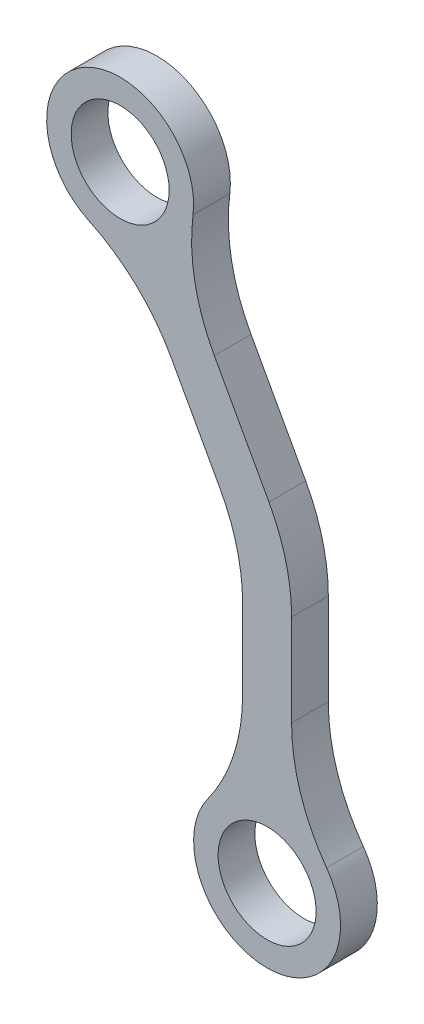
ISO-10303-21;
HEADER;
FILE_DESCRIPTION(('STEP AP214'),'2;1');
FILE_NAME('part.step','',(''),(''),'','','');
FILE_SCHEMA(('AUTOMOTIVE_DESIGN { 1 0 10303 214 1 1 1 1 }'));
ENDSEC;
DATA;
#1=APPLICATION_CONTEXT('core data for automotive mechanical design processes');
#2=APPLICATION_PROTOCOL_DEFINITION('international standard','automotive_design',2000,#1);
#3=PRODUCT_CONTEXT('',#1,'mechanical');
#4=PRODUCT('Part','Part','',(#3));
#5=PRODUCT_RELATED_PRODUCT_CATEGORY('part','',(#4));
#6=PRODUCT_DEFINITION_FORMATION('','',#4);
#7=PRODUCT_DEFINITION_CONTEXT('part definition',#1,'design');
#8=PRODUCT_DEFINITION('design','',#6,#7);
#9=PRODUCT_DEFINITION_SHAPE('','',#8);
#10=(LENGTH_UNIT() NAMED_UNIT(*) SI_UNIT(.MILLI.,.METRE.));
#11=(NAMED_UNIT(*) PLANE_ANGLE_UNIT() SI_UNIT($,.RADIAN.));
#12=(NAMED_UNIT(*) SI_UNIT($,.STERADIAN.) SOLID_ANGLE_UNIT());
#13=UNCERTAINTY_MEASURE_WITH_UNIT(LENGTH_MEASURE(1.E-05),#10,'distance_accuracy_value','');
#14=(GEOMETRIC_REPRESENTATION_CONTEXT(3) GLOBAL_UNCERTAINTY_ASSIGNED_CONTEXT((#13)) GLOBAL_UNIT_ASSIGNED_CONTEXT((#10,
#11,#12)) REPRESENTATION_CONTEXT('',''));
#15=CARTESIAN_POINT('',(0.,0.,0.));
#16=DIRECTION('',(0.,0.,1.));
#17=DIRECTION('',(1.,0.,0.));
#18=AXIS2_PLACEMENT_3D('',#15,#16,#17);
#19=CARTESIAN_POINT('',(0.,0.,1.5));
#20=DIRECTION('',(0.,0.,1.));
#21=DIRECTION('',(1.,0.,0.));
#22=AXIS2_PLACEMENT_3D('',#19,#20,#21);
#23=PLANE('',#22);
#24=CARTESIAN_POINT('',(0.,0.,1.5));
#25=DIRECTION('',(0.,0.,1.));
#26=DIRECTION('',(1.,0.,0.));
#27=AXIS2_PLACEMENT_3D('',#24,#25,#26);
#28=CIRCLE('',#27,4.);
#29=CARTESIAN_POINT('',(4.,0.,1.5));
#30=VERTEX_POINT('',#29);
#31=EDGE_CURVE('E158',#30,#30,#28,.T.);
#32=ORIENTED_EDGE('',*,*,#31,.F.);
#33=EDGE_LOOP('',(#32));
#34=FACE_BOUND('',#33,.T.);
#35=DIRECTION('',(0.,1.,0.));
#36=VECTOR('',#35,1.);
#37=CARTESIAN_POINT('',(2.,5.65685424949238,1.5));
#38=LINE('',#37,#36);
#39=CARTESIAN_POINT('',(2.,12.3288280059379,1.5));
#40=VERTEX_POINT('',#39);
#41=CARTESIAN_POINT('',(2.,19.8098581728258,1.5));
#42=VERTEX_POINT('',#41);
#43=EDGE_CURVE('E144',#40,#42,#38,.T.);
#44=ORIENTED_EDGE('',*,*,#43,.T.);
#45=CARTESIAN_POINT('',(-13.,19.8098581728258,1.5));
#46=DIRECTION('',(0.,0.,1.));
#47=DIRECTION('',(1.,0.,0.));
#48=AXIS2_PLACEMENT_3D('',#45,#46,#47);
#49=CIRCLE('',#48,15.);
#50=CARTESIAN_POINT('',(0.148529964453211,27.0290104619714,1.5));
#51=VERTEX_POINT('',#50);
#52=EDGE_CURVE('E181',#42,#51,#49,.T.);
#53=ORIENTED_EDGE('',*,*,#52,.T.);
#54=DIRECTION('',(-0.481276819276373,0.876568664296881,0.));
#55=VECTOR('',#54,1.);
#56=CARTESIAN_POINT('',(2.,23.6568542494924,1.5));
#57=LINE('',#56,#55);
#58=CARTESIAN_POINT('',(-4.31328354330297,35.1554893410418,1.5));
#59=VERTEX_POINT('',#58);
#60=EDGE_CURVE('E226',#51,#59,#57,.T.);
#61=ORIENTED_EDGE('',*,*,#60,.T.);
#62=CARTESIAN_POINT('',(8.83524642115024,42.3746416301873,1.5));
#63=DIRECTION('',(0.,0.,1.));
#64=DIRECTION('',(1.,0.,0.));
#65=AXIS2_PLACEMENT_3D('',#62,#63,#64);
#66=CIRCLE('',#65,15.);
#67=CARTESIAN_POINT('',(-6.04707245109994,44.249897608625,1.5));
#68=VERTEX_POINT('',#67);
#69=EDGE_CURVE('E199',#59,#68,#66,.F.);
#70=ORIENTED_EDGE('',*,*,#69,.T.);
#71=CARTESIAN_POINT('',(-12.,45.,1.5));
#72=DIRECTION('',(0.,0.,1.));
#73=DIRECTION('',(1.,0.,0.));
#74=AXIS2_PLACEMENT_3D('',#71,#72,#73);
#75=CIRCLE('',#74,5.99999999999999);
#76=CARTESIAN_POINT('',(-14.5623109042696,39.5746370785116,1.5));
#77=VERTEX_POINT('',#76);
#78=EDGE_CURVE('E221',#68,#77,#75,.T.);
#79=ORIENTED_EDGE('',*,*,#78,.T.);
#80=CARTESIAN_POINT('',(-20.9680881649437,26.0112297747907,1.5));
#81=DIRECTION('',(0.,0.,1.));
#82=DIRECTION('',(1.,0.,0.));
#83=AXIS2_PLACEMENT_3D('',#80,#81,#82);
#84=CIRCLE('',#83,15.);
#85=CARTESIAN_POINT('',(-7.8195582004905,33.2303820639363,1.5));
#86=VERTEX_POINT('',#85);
#87=EDGE_CURVE('E11',#77,#86,#84,.F.);
#88=ORIENTED_EDGE('',*,*,#87,.T.);
#89=DIRECTION('',(0.481276819276372,-0.876568664296881,0.));
#90=VECTOR('',#89,1.);
#91=CARTESIAN_POINT('',(-2.,22.6309886290479,1.5));
#92=LINE('',#91,#90);
#93=CARTESIAN_POINT('',(-3.85147003554678,26.0031448415269,1.5));
#94=VERTEX_POINT('',#93);
#95=EDGE_CURVE('E220',#86,#94,#92,.T.);
#96=ORIENTED_EDGE('',*,*,#95,.T.);
#97=CARTESIAN_POINT('',(-17.,18.7839925523813,1.5));
#98=DIRECTION('',(0.,0.,1.));
#99=DIRECTION('',(1.,0.,0.));
#100=AXIS2_PLACEMENT_3D('',#97,#98,#99);
#101=CIRCLE('',#100,15.);
#102=CARTESIAN_POINT('',(-2.,18.7839925523813,1.5));
#103=VERTEX_POINT('',#102);
#104=EDGE_CURVE('E56',#94,#103,#101,.F.);
#105=ORIENTED_EDGE('',*,*,#104,.T.);
#106=DIRECTION('',(0.,-1.,0.));
#107=VECTOR('',#106,1.);
#108=CARTESIAN_POINT('',(-2.,5.65685424949238,1.5));
#109=LINE('',#108,#107);
#110=CARTESIAN_POINT('',(-2.,12.3288280059379,1.5));
#111=VERTEX_POINT('',#110);
#112=EDGE_CURVE('E170',#103,#111,#109,.T.);
#113=ORIENTED_EDGE('',*,*,#112,.T.);
#114=CARTESIAN_POINT('',(-17.,12.3288280059379,1.5));
#115=DIRECTION('',(0.,0.,1.));
#116=DIRECTION('',(1.,0.,0.));
#117=AXIS2_PLACEMENT_3D('',#114,#115,#116);
#118=CIRCLE('',#117,15.);
#119=CARTESIAN_POINT('',(-4.85714285714286,3.52252228741084,1.5));
#120=VERTEX_POINT('',#119);
#121=EDGE_CURVE('E203',#111,#120,#118,.F.);
#122=ORIENTED_EDGE('',*,*,#121,.T.);
#123=CARTESIAN_POINT('',(0.,0.,1.5));
#124=DIRECTION('',(0.,0.,1.));
#125=DIRECTION('',(1.,0.,0.));
#126=AXIS2_PLACEMENT_3D('',#123,#124,#125);
#127=CIRCLE('',#126,6.);
#128=CARTESIAN_POINT('',(4.85714285714286,3.52252228741084,1.5));
#129=VERTEX_POINT('',#128);
#130=EDGE_CURVE('E169',#120,#129,#127,.T.);
#131=ORIENTED_EDGE('',*,*,#130,.T.);
#132=CARTESIAN_POINT('',(17.,12.3288280059379,1.5));
#133=DIRECTION('',(0.,0.,1.));
#134=DIRECTION('',(1.,0.,0.));
#135=AXIS2_PLACEMENT_3D('',#132,#133,#134);
#136=CIRCLE('',#135,15.);
#137=EDGE_CURVE('E134',#129,#40,#136,.F.);
#138=ORIENTED_EDGE('',*,*,#137,.T.);
#139=EDGE_LOOP('',(#44,#53,#61,#70,#79,#88,#96,#105,#113,#122,#131,#138));
#140=FACE_BOUND('',#139,.T.);
#141=CARTESIAN_POINT('',(-12.,45.,1.5));
#142=DIRECTION('',(0.,0.,1.));
#143=DIRECTION('',(1.,0.,0.));
#144=AXIS2_PLACEMENT_3D('',#141,#142,#143);
#145=CIRCLE('',#144,4.);
#146=CARTESIAN_POINT('',(-8.,45.,1.5));
#147=VERTEX_POINT('',#146);
#148=EDGE_CURVE('E237',#147,#147,#145,.T.);
#149=ORIENTED_EDGE('',*,*,#148,.F.);
#150=EDGE_LOOP('',(#149));
#151=FACE_BOUND('',#150,.T.);
#152=ADVANCED_FACE('F34',(#34,#140,#151),#23,.T.);
#153=CARTESIAN_POINT('',(0.,0.,-1.5));
#154=DIRECTION('',(0.,0.,1.));
#155=DIRECTION('',(1.,0.,0.));
#156=AXIS2_PLACEMENT_3D('',#153,#154,#155);
#157=PLANE('',#156);
#158=CARTESIAN_POINT('',(0.,0.,-1.5));
#159=DIRECTION('',(0.,0.,1.));
#160=DIRECTION('',(1.,0.,0.));
#161=AXIS2_PLACEMENT_3D('',#158,#159,#160);
#162=CIRCLE('',#161,4.);
#163=CARTESIAN_POINT('',(4.,0.,-1.5));
#164=VERTEX_POINT('',#163);
#165=EDGE_CURVE('E234',#164,#164,#162,.T.);
#166=ORIENTED_EDGE('',*,*,#165,.T.);
#167=EDGE_LOOP('',(#166));
#168=FACE_BOUND('',#167,.T.);
#169=DIRECTION('',(-0.481276819276373,0.876568664296881,0.));
#170=VECTOR('',#169,1.);
#171=CARTESIAN_POINT('',(2.,23.6568542494924,-1.5));
#172=LINE('',#171,#170);
#173=CARTESIAN_POINT('',(0.148529964453211,27.0290104619714,-1.5));
#174=VERTEX_POINT('',#173);
#175=CARTESIAN_POINT('',(-4.31328354330297,35.1554893410418,-1.5));
#176=VERTEX_POINT('',#175);
#177=EDGE_CURVE('E152',#174,#176,#172,.T.);
#178=ORIENTED_EDGE('',*,*,#177,.F.);
#179=CARTESIAN_POINT('',(-13.,19.8098581728258,-1.5));
#180=DIRECTION('',(0.,0.,1.));
#181=DIRECTION('',(1.,0.,0.));
#182=AXIS2_PLACEMENT_3D('',#179,#180,#181);
#183=CIRCLE('',#182,15.);
#184=CARTESIAN_POINT('',(2.,19.8098581728258,-1.5));
#185=VERTEX_POINT('',#184);
#186=EDGE_CURVE('E151',#174,#185,#183,.F.);
#187=ORIENTED_EDGE('',*,*,#186,.T.);
#188=DIRECTION('',(0.,1.,0.));
#189=VECTOR('',#188,1.);
#190=CARTESIAN_POINT('',(2.,5.65685424949238,-1.5));
#191=LINE('',#190,#189);
#192=CARTESIAN_POINT('',(2.,12.3288280059379,-1.5));
#193=VERTEX_POINT('',#192);
#194=EDGE_CURVE('E141',#193,#185,#191,.T.);
#195=ORIENTED_EDGE('',*,*,#194,.F.);
#196=CARTESIAN_POINT('',(17.,12.3288280059379,-1.5));
#197=DIRECTION('',(0.,0.,1.));
#198=DIRECTION('',(1.,0.,0.));
#199=AXIS2_PLACEMENT_3D('',#196,#197,#198);
#200=CIRCLE('',#199,15.);
#201=CARTESIAN_POINT('',(4.85714285714286,3.52252228741084,-1.5));
#202=VERTEX_POINT('',#201);
#203=EDGE_CURVE('E124',#193,#202,#200,.T.);
#204=ORIENTED_EDGE('',*,*,#203,.T.);
#205=CARTESIAN_POINT('',(0.,0.,-1.5));
#206=DIRECTION('',(0.,0.,1.));
#207=DIRECTION('',(1.,0.,0.));
#208=AXIS2_PLACEMENT_3D('',#205,#206,#207);
#209=CIRCLE('',#208,6.);
#210=CARTESIAN_POINT('',(-4.85714285714286,3.52252228741084,-1.5));
#211=VERTEX_POINT('',#210);
#212=EDGE_CURVE('E153',#211,#202,#209,.T.);
#213=ORIENTED_EDGE('',*,*,#212,.F.);
#214=CARTESIAN_POINT('',(-17.,12.3288280059379,-1.5));
#215=DIRECTION('',(0.,0.,1.));
#216=DIRECTION('',(1.,0.,0.));
#217=AXIS2_PLACEMENT_3D('',#214,#215,#216);
#218=CIRCLE('',#217,15.);
#219=CARTESIAN_POINT('',(-2.,12.3288280059379,-1.5));
#220=VERTEX_POINT('',#219);
#221=EDGE_CURVE('E201',#211,#220,#218,.T.);
#222=ORIENTED_EDGE('',*,*,#221,.T.);
#223=DIRECTION('',(0.,-1.,0.));
#224=VECTOR('',#223,1.);
#225=CARTESIAN_POINT('',(-2.,5.65685424949238,-1.5));
#226=LINE('',#225,#224);
#227=CARTESIAN_POINT('',(-2.,18.7839925523813,-1.5));
#228=VERTEX_POINT('',#227);
#229=EDGE_CURVE('E167',#228,#220,#226,.T.);
#230=ORIENTED_EDGE('',*,*,#229,.F.);
#231=CARTESIAN_POINT('',(-17.,18.7839925523813,-1.5));
#232=DIRECTION('',(0.,0.,1.));
#233=DIRECTION('',(1.,0.,0.));
#234=AXIS2_PLACEMENT_3D('',#231,#232,#233);
#235=CIRCLE('',#234,15.);
#236=CARTESIAN_POINT('',(-3.85147003554678,26.0031448415269,-1.5));
#237=VERTEX_POINT('',#236);
#238=EDGE_CURVE('E205',#228,#237,#235,.T.);
#239=ORIENTED_EDGE('',*,*,#238,.T.);
#240=DIRECTION('',(0.481276819276372,-0.876568664296881,0.));
#241=VECTOR('',#240,1.);
#242=CARTESIAN_POINT('',(-2.,22.6309886290479,-1.5));
#243=LINE('',#242,#241);
#244=CARTESIAN_POINT('',(-7.8195582004905,33.2303820639363,-1.5));
#245=VERTEX_POINT('',#244);
#246=EDGE_CURVE('E164',#245,#237,#243,.T.);
#247=ORIENTED_EDGE('',*,*,#246,.F.);
#248=CARTESIAN_POINT('',(-20.9680881649437,26.0112297747907,-1.5));
#249=DIRECTION('',(0.,0.,1.));
#250=DIRECTION('',(1.,0.,0.));
#251=AXIS2_PLACEMENT_3D('',#248,#249,#250);
#252=CIRCLE('',#251,15.);
#253=CARTESIAN_POINT('',(-14.5623109042696,39.5746370785116,-1.5));
#254=VERTEX_POINT('',#253);
#255=EDGE_CURVE('E42',#245,#254,#252,.T.);
#256=ORIENTED_EDGE('',*,*,#255,.T.);
#257=CARTESIAN_POINT('',(-12.,45.,-1.5));
#258=DIRECTION('',(0.,0.,1.));
#259=DIRECTION('',(1.,0.,0.));
#260=AXIS2_PLACEMENT_3D('',#257,#258,#259);
#261=CIRCLE('',#260,5.99999999999999);
#262=CARTESIAN_POINT('',(-6.04707245109994,44.249897608625,-1.5));
#263=VERTEX_POINT('',#262);
#264=EDGE_CURVE('E156',#263,#254,#261,.T.);
#265=ORIENTED_EDGE('',*,*,#264,.F.);
#266=CARTESIAN_POINT('',(8.83524642115024,42.3746416301873,-1.5));
#267=DIRECTION('',(0.,0.,1.));
#268=DIRECTION('',(1.,0.,0.));
#269=AXIS2_PLACEMENT_3D('',#266,#267,#268);
#270=CIRCLE('',#269,15.);
#271=EDGE_CURVE('E197',#263,#176,#270,.T.);
#272=ORIENTED_EDGE('',*,*,#271,.T.);
#273=EDGE_LOOP('',(#178,#187,#195,#204,#213,#222,#230,#239,#247,#256,#265,#272));
#274=FACE_BOUND('',#273,.T.);
#275=CARTESIAN_POINT('',(-12.,45.,-1.5));
#276=DIRECTION('',(0.,0.,1.));
#277=DIRECTION('',(1.,0.,0.));
#278=AXIS2_PLACEMENT_3D('',#275,#276,#277);
#279=CIRCLE('',#278,4.);
#280=CARTESIAN_POINT('',(-8.,45.,-1.5));
#281=VERTEX_POINT('',#280);
#282=EDGE_CURVE('E240',#281,#281,#279,.T.);
#283=ORIENTED_EDGE('',*,*,#282,.T.);
#284=EDGE_LOOP('',(#283));
#285=FACE_BOUND('',#284,.T.);
#286=ADVANCED_FACE('F149',(#168,#274,#285),#157,.F.);
#287=CARTESIAN_POINT('',(0.,0.,1.5));
#288=DIRECTION('',(0.,0.,-1.));
#289=DIRECTION('',(-1.,0.,0.));
#290=AXIS2_PLACEMENT_3D('',#287,#288,#289);
#291=CYLINDRICAL_SURFACE('',#290,6.);
#292=ORIENTED_EDGE('',*,*,#212,.T.);
#293=DIRECTION('',(0.,0.,-1.));
#294=VECTOR('',#293,1.);
#295=CARTESIAN_POINT('',(4.85714285714286,3.52252228741084,1.5));
#296=LINE('',#295,#294);
#297=EDGE_CURVE('E129',#202,#129,#296,.F.);
#298=ORIENTED_EDGE('',*,*,#297,.T.);
#299=ORIENTED_EDGE('',*,*,#130,.F.);
#300=DIRECTION('',(0.,0.,-1.));
#301=VECTOR('',#300,1.);
#302=CARTESIAN_POINT('',(-4.85714285714286,3.52252228741084,1.5));
#303=LINE('',#302,#301);
#304=EDGE_CURVE('E145',#120,#211,#303,.T.);
#305=ORIENTED_EDGE('',*,*,#304,.T.);
#306=EDGE_LOOP('',(#292,#298,#299,#305));
#307=FACE_BOUND('',#306,.T.);
#308=ADVANCED_FACE('F254',(#307),#291,.T.);
#309=CARTESIAN_POINT('',(2.,5.65685424949238,1.5));
#310=DIRECTION('',(-1.,0.,0.));
#311=DIRECTION('',(0.,0.,1.));
#312=AXIS2_PLACEMENT_3D('',#309,#310,#311);
#313=PLANE('',#312);
#314=ORIENTED_EDGE('',*,*,#43,.F.);
#315=DIRECTION('',(0.,0.,1.));
#316=VECTOR('',#315,1.);
#317=CARTESIAN_POINT('',(2.,12.3288280059379,-1.5));
#318=LINE('',#317,#316);
#319=EDGE_CURVE('E128',#40,#193,#318,.F.);
#320=ORIENTED_EDGE('',*,*,#319,.T.);
#321=ORIENTED_EDGE('',*,*,#194,.T.);
#322=DIRECTION('',(0.,0.,-1.));
#323=VECTOR('',#322,1.);
#324=CARTESIAN_POINT('',(2.,19.8098581728258,1.5));
#325=LINE('',#324,#323);
#326=EDGE_CURVE('E146',#185,#42,#325,.F.);
#327=ORIENTED_EDGE('',*,*,#326,.T.);
#328=EDGE_LOOP('',(#314,#320,#321,#327));
#329=FACE_BOUND('',#328,.T.);
#330=ADVANCED_FACE('F140',(#329),#313,.F.);
#331=CARTESIAN_POINT('',(2.,23.6568542494924,1.5));
#332=DIRECTION('',(-0.876568664296881,-0.481276819276373,0.));
#333=DIRECTION('',(0.481276819276373,-0.876568664296881,0.));
#334=AXIS2_PLACEMENT_3D('',#331,#332,#333);
#335=PLANE('',#334);
#336=ORIENTED_EDGE('',*,*,#60,.F.);
#337=DIRECTION('',(0.,0.,-1.));
#338=VECTOR('',#337,1.);
#339=CARTESIAN_POINT('',(0.148529964453211,27.0290104619714,1.5));
#340=LINE('',#339,#338);
#341=EDGE_CURVE('E177',#51,#174,#340,.T.);
#342=ORIENTED_EDGE('',*,*,#341,.T.);
#343=ORIENTED_EDGE('',*,*,#177,.T.);
#344=DIRECTION('',(0.,0.,1.));
#345=VECTOR('',#344,1.);
#346=CARTESIAN_POINT('',(-4.31328354330297,35.1554893410418,1.5));
#347=LINE('',#346,#345);
#348=EDGE_CURVE('E175',#176,#59,#347,.T.);
#349=ORIENTED_EDGE('',*,*,#348,.T.);
#350=EDGE_LOOP('',(#336,#342,#343,#349));
#351=FACE_BOUND('',#350,.T.);
#352=ADVANCED_FACE('F269',(#351),#335,.F.);
#353=CARTESIAN_POINT('',(-12.,45.,1.5));
#354=DIRECTION('',(0.,0.,-1.));
#355=DIRECTION('',(-1.,0.,0.));
#356=AXIS2_PLACEMENT_3D('',#353,#354,#355);
#357=CYLINDRICAL_SURFACE('',#356,5.99999999999999);
#358=ORIENTED_EDGE('',*,*,#78,.F.);
#359=DIRECTION('',(0.,0.,-1.));
#360=VECTOR('',#359,1.);
#361=CARTESIAN_POINT('',(-6.04707245109994,44.249897608625,1.5));
#362=LINE('',#361,#360);
#363=EDGE_CURVE('E185',#68,#263,#362,.T.);
#364=ORIENTED_EDGE('',*,*,#363,.T.);
#365=ORIENTED_EDGE('',*,*,#264,.T.);
#366=DIRECTION('',(0.,0.,-1.));
#367=VECTOR('',#366,1.);
#368=CARTESIAN_POINT('',(-14.5623109042696,39.5746370785116,1.5));
#369=LINE('',#368,#367);
#370=EDGE_CURVE('E183',#254,#77,#369,.F.);
#371=ORIENTED_EDGE('',*,*,#370,.T.);
#372=EDGE_LOOP('',(#358,#364,#365,#371));
#373=FACE_BOUND('',#372,.T.);
#374=ADVANCED_FACE('F214',(#373),#357,.T.);
#375=CARTESIAN_POINT('',(-2.,22.6309886290479,1.5));
#376=DIRECTION('',(0.876568664296881,0.481276819276372,0.));
#377=DIRECTION('',(-0.481276819276372,0.876568664296881,0.));
#378=AXIS2_PLACEMENT_3D('',#375,#376,#377);
#379=PLANE('',#378);
#380=ORIENTED_EDGE('',*,*,#246,.T.);
#381=DIRECTION('',(0.,0.,-1.));
#382=VECTOR('',#381,1.);
#383=CARTESIAN_POINT('',(-3.85147003554678,26.0031448415269,1.5));
#384=LINE('',#383,#382);
#385=EDGE_CURVE('E135',#237,#94,#384,.F.);
#386=ORIENTED_EDGE('',*,*,#385,.T.);
#387=ORIENTED_EDGE('',*,*,#95,.F.);
#388=DIRECTION('',(0.,0.,1.));
#389=VECTOR('',#388,1.);
#390=CARTESIAN_POINT('',(-7.8195582004905,33.2303820639363,-1.5));
#391=LINE('',#390,#389);
#392=EDGE_CURVE('E192',#86,#245,#391,.F.);
#393=ORIENTED_EDGE('',*,*,#392,.T.);
#394=EDGE_LOOP('',(#380,#386,#387,#393));
#395=FACE_BOUND('',#394,.T.);
#396=ADVANCED_FACE('F223',(#395),#379,.F.);
#397=CARTESIAN_POINT('',(-2.,5.65685424949238,1.5));
#398=DIRECTION('',(1.,0.,0.));
#399=DIRECTION('',(0.,0.,-1.));
#400=AXIS2_PLACEMENT_3D('',#397,#398,#399);
#401=PLANE('',#400);
#402=ORIENTED_EDGE('',*,*,#229,.T.);
#403=DIRECTION('',(0.,0.,1.));
#404=VECTOR('',#403,1.);
#405=CARTESIAN_POINT('',(-2.,12.3288280059379,1.5));
#406=LINE('',#405,#404);
#407=EDGE_CURVE('E49',#220,#111,#406,.T.);
#408=ORIENTED_EDGE('',*,*,#407,.T.);
#409=ORIENTED_EDGE('',*,*,#112,.F.);
#410=DIRECTION('',(0.,0.,-1.));
#411=VECTOR('',#410,1.);
#412=CARTESIAN_POINT('',(-2.,18.7839925523813,-1.5));
#413=LINE('',#412,#411);
#414=EDGE_CURVE('E188',#103,#228,#413,.T.);
#415=ORIENTED_EDGE('',*,*,#414,.T.);
#416=EDGE_LOOP('',(#402,#408,#409,#415));
#417=FACE_BOUND('',#416,.T.);
#418=ADVANCED_FACE('F262',(#417),#401,.F.);
#419=CARTESIAN_POINT('',(0.,0.,1.5));
#420=DIRECTION('',(0.,0.,-1.));
#421=DIRECTION('',(-1.,0.,0.));
#422=AXIS2_PLACEMENT_3D('',#419,#420,#421);
#423=CYLINDRICAL_SURFACE('',#422,4.);
#424=ORIENTED_EDGE('',*,*,#31,.T.);
#425=EDGE_LOOP('',(#424));
#426=FACE_BOUND('',#425,.T.);
#427=ORIENTED_EDGE('',*,*,#165,.F.);
#428=EDGE_LOOP('',(#427));
#429=FACE_BOUND('',#428,.T.);
#430=ADVANCED_FACE('F259',(#426,#429),#423,.F.);
#431=CARTESIAN_POINT('',(-12.,45.,1.5));
#432=DIRECTION('',(0.,0.,-1.));
#433=DIRECTION('',(-1.,0.,0.));
#434=AXIS2_PLACEMENT_3D('',#431,#432,#433);
#435=CYLINDRICAL_SURFACE('',#434,4.);
#436=ORIENTED_EDGE('',*,*,#148,.T.);
#437=EDGE_LOOP('',(#436));
#438=FACE_BOUND('',#437,.T.);
#439=ORIENTED_EDGE('',*,*,#282,.F.);
#440=EDGE_LOOP('',(#439));
#441=FACE_BOUND('',#440,.T.);
#442=ADVANCED_FACE('F246',(#438,#441),#435,.F.);
#443=CARTESIAN_POINT('',(17.,12.3288280059379,1.5));
#444=DIRECTION('',(0.,0.,-1.));
#445=DIRECTION('',(-1.,0.,0.));
#446=AXIS2_PLACEMENT_3D('',#443,#444,#445);
#447=CYLINDRICAL_SURFACE('',#446,15.);
#448=ORIENTED_EDGE('',*,*,#137,.F.);
#449=ORIENTED_EDGE('',*,*,#297,.F.);
#450=ORIENTED_EDGE('',*,*,#203,.F.);
#451=ORIENTED_EDGE('',*,*,#319,.F.);
#452=EDGE_LOOP('',(#448,#449,#450,#451));
#453=FACE_BOUND('',#452,.T.);
#454=ADVANCED_FACE('F127',(#453),#447,.F.);
#455=CARTESIAN_POINT('',(-13.,19.8098581728258,1.5));
#456=DIRECTION('',(0.,0.,-1.));
#457=DIRECTION('',(-1.,0.,0.));
#458=AXIS2_PLACEMENT_3D('',#455,#456,#457);
#459=CYLINDRICAL_SURFACE('',#458,15.);
#460=ORIENTED_EDGE('',*,*,#52,.F.);
#461=ORIENTED_EDGE('',*,*,#326,.F.);
#462=ORIENTED_EDGE('',*,*,#186,.F.);
#463=ORIENTED_EDGE('',*,*,#341,.F.);
#464=EDGE_LOOP('',(#460,#461,#462,#463));
#465=FACE_BOUND('',#464,.T.);
#466=ADVANCED_FACE('F280',(#465),#459,.T.);
#467=CARTESIAN_POINT('',(8.83524642115024,42.3746416301873,1.5));
#468=DIRECTION('',(0.,0.,-1.));
#469=DIRECTION('',(-1.,0.,0.));
#470=AXIS2_PLACEMENT_3D('',#467,#468,#469);
#471=CYLINDRICAL_SURFACE('',#470,15.);
#472=ORIENTED_EDGE('',*,*,#69,.F.);
#473=ORIENTED_EDGE('',*,*,#348,.F.);
#474=ORIENTED_EDGE('',*,*,#271,.F.);
#475=ORIENTED_EDGE('',*,*,#363,.F.);
#476=EDGE_LOOP('',(#472,#473,#474,#475));
#477=FACE_BOUND('',#476,.T.);
#478=ADVANCED_FACE('F283',(#477),#471,.F.);
#479=CARTESIAN_POINT('',(-17.,12.3288280059379,1.5));
#480=DIRECTION('',(0.,0.,-1.));
#481=DIRECTION('',(-1.,0.,0.));
#482=AXIS2_PLACEMENT_3D('',#479,#480,#481);
#483=CYLINDRICAL_SURFACE('',#482,15.);
#484=ORIENTED_EDGE('',*,*,#121,.F.);
#485=ORIENTED_EDGE('',*,*,#407,.F.);
#486=ORIENTED_EDGE('',*,*,#221,.F.);
#487=ORIENTED_EDGE('',*,*,#304,.F.);
#488=EDGE_LOOP('',(#484,#485,#486,#487));
#489=FACE_BOUND('',#488,.T.);
#490=ADVANCED_FACE('F287',(#489),#483,.F.);
#491=CARTESIAN_POINT('',(-17.,18.7839925523813,1.5));
#492=DIRECTION('',(0.,0.,1.));
#493=DIRECTION('',(1.,0.,0.));
#494=AXIS2_PLACEMENT_3D('',#491,#492,#493);
#495=CYLINDRICAL_SURFACE('',#494,15.);
#496=ORIENTED_EDGE('',*,*,#104,.F.);
#497=ORIENTED_EDGE('',*,*,#385,.F.);
#498=ORIENTED_EDGE('',*,*,#238,.F.);
#499=ORIENTED_EDGE('',*,*,#414,.F.);
#500=EDGE_LOOP('',(#496,#497,#498,#499));
#501=FACE_BOUND('',#500,.T.);
#502=ADVANCED_FACE('F290',(#501),#495,.F.);
#503=CARTESIAN_POINT('',(-20.9680881649437,26.0112297747907,1.5));
#504=DIRECTION('',(0.,0.,-1.));
#505=DIRECTION('',(-1.,0.,0.));
#506=AXIS2_PLACEMENT_3D('',#503,#504,#505);
#507=CYLINDRICAL_SURFACE('',#506,15.);
#508=ORIENTED_EDGE('',*,*,#87,.F.);
#509=ORIENTED_EDGE('',*,*,#370,.F.);
#510=ORIENTED_EDGE('',*,*,#255,.F.);
#511=ORIENTED_EDGE('',*,*,#392,.F.);
#512=EDGE_LOOP('',(#508,#509,#510,#511));
#513=FACE_BOUND('',#512,.T.);
#514=ADVANCED_FACE('F36',(#513),#507,.F.);
#515=CLOSED_SHELL('',(#152,#286,#308,#330,#352,#374,#396,#418,#430,#442,#454,#466,#478,#490,
#502,#514));
#516=MANIFOLD_SOLID_BREP('B2',#515);
#517=ADVANCED_BREP_SHAPE_REPRESENTATION('',(#18,#516),#14);
#518=SHAPE_DEFINITION_REPRESENTATION(#9,#517);
ENDSEC;
END-ISO-10303-21;
